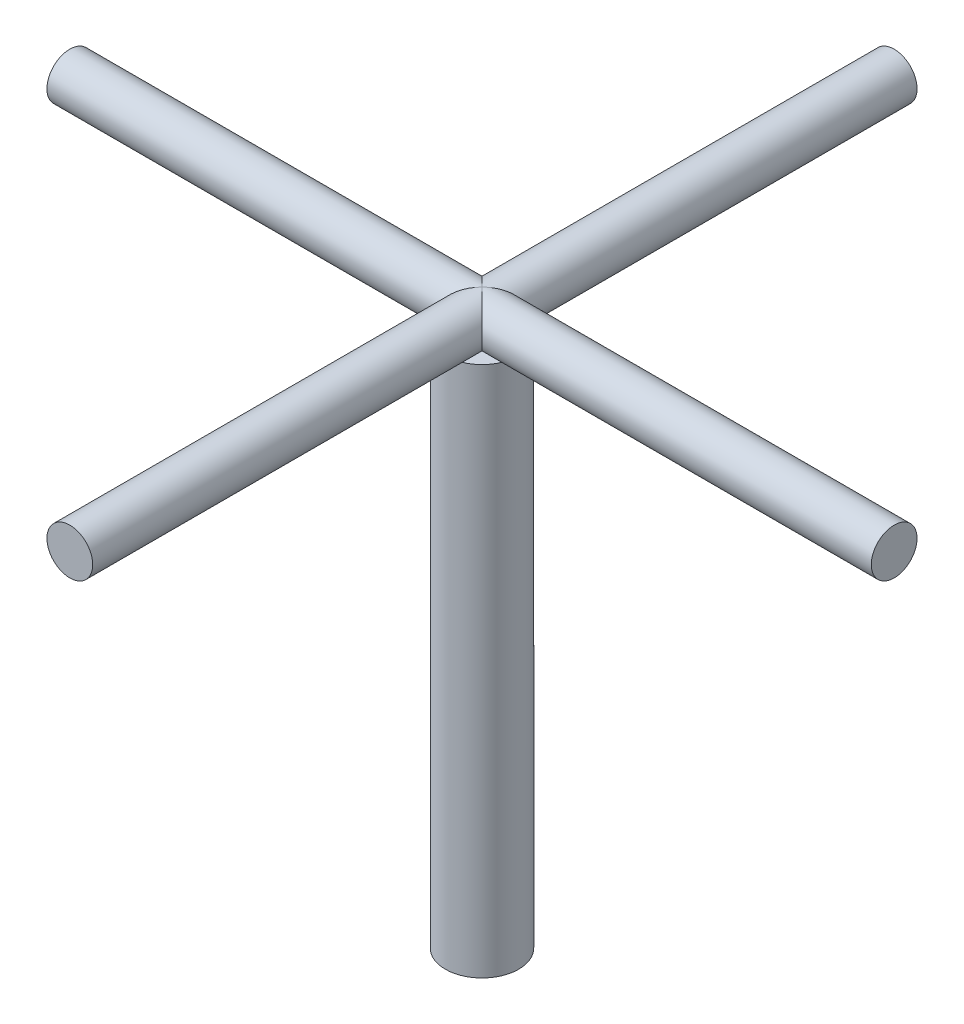
ISO-10303-21;
HEADER;
FILE_DESCRIPTION(('STEP AP214'),'2;1');
FILE_NAME('part.step','',(''),(''),'','','');
FILE_SCHEMA(('AUTOMOTIVE_DESIGN { 1 0 10303 214 1 1 1 1 }'));
ENDSEC;
DATA;
#1=APPLICATION_CONTEXT('core data for automotive mechanical design processes');
#2=APPLICATION_PROTOCOL_DEFINITION('international standard','automotive_design',2000,#1);
#3=PRODUCT_CONTEXT('',#1,'mechanical');
#4=PRODUCT('Part','Part','',(#3));
#5=PRODUCT_RELATED_PRODUCT_CATEGORY('part','',(#4));
#6=PRODUCT_DEFINITION_FORMATION('','',#4);
#7=PRODUCT_DEFINITION_CONTEXT('part definition',#1,'design');
#8=PRODUCT_DEFINITION('design','',#6,#7);
#9=PRODUCT_DEFINITION_SHAPE('','',#8);
#10=(LENGTH_UNIT() NAMED_UNIT(*) SI_UNIT(.MILLI.,.METRE.));
#11=(NAMED_UNIT(*) PLANE_ANGLE_UNIT() SI_UNIT($,.RADIAN.));
#12=(NAMED_UNIT(*) SI_UNIT($,.STERADIAN.) SOLID_ANGLE_UNIT());
#13=UNCERTAINTY_MEASURE_WITH_UNIT(LENGTH_MEASURE(1.E-05),#10,'distance_accuracy_value','');
#14=(GEOMETRIC_REPRESENTATION_CONTEXT(3) GLOBAL_UNCERTAINTY_ASSIGNED_CONTEXT((#13)) GLOBAL_UNIT_ASSIGNED_CONTEXT((#10,
#11,#12)) REPRESENTATION_CONTEXT('',''));
#15=CARTESIAN_POINT('',(0.,0.,0.));
#16=DIRECTION('',(0.,0.,1.));
#17=DIRECTION('',(1.,0.,0.));
#18=AXIS2_PLACEMENT_3D('',#15,#16,#17);
#19=CARTESIAN_POINT('',(0.,580.,0.));
#20=DIRECTION('',(0.,1.,0.));
#21=DIRECTION('',(0.,0.,1.));
#22=AXIS2_PLACEMENT_3D('',#19,#20,#21);
#23=PLANE('',#22);
#24=DIRECTION('',(1.,0.,0.));
#25=VECTOR('',#24,1.);
#26=CARTESIAN_POINT('',(-1.57116660247941E-13,580.,15.));
#27=LINE('',#26,#25);
#28=CARTESIAN_POINT('',(15.,580.,15.0000000000001));
#29=VERTEX_POINT('',#28);
#30=CARTESIAN_POINT('',(37.0809924354782,580.,15.0000000000004));
#31=VERTEX_POINT('',#30);
#32=EDGE_CURVE('E149',#29,#31,#27,.T.);
#33=ORIENTED_EDGE('',*,*,#32,.F.);
#34=DIRECTION('',(0.,0.,1.));
#35=VECTOR('',#34,1.);
#36=CARTESIAN_POINT('',(15.,580.,0.));
#37=LINE('',#36,#35);
#38=CARTESIAN_POINT('',(15.,580.,37.0809924354783));
#39=VERTEX_POINT('',#38);
#40=EDGE_CURVE('E134',#39,#29,#37,.F.);
#41=ORIENTED_EDGE('',*,*,#40,.F.);
#42=CARTESIAN_POINT('',(0.,580.,0.));
#43=DIRECTION('',(0.,1.,0.));
#44=DIRECTION('',(0.,0.,1.));
#45=AXIS2_PLACEMENT_3D('',#42,#43,#44);
#46=CIRCLE('',#45,40.);
#47=EDGE_CURVE('E150',#39,#31,#46,.T.);
#48=ORIENTED_EDGE('',*,*,#47,.T.);
#49=EDGE_LOOP('',(#33,#41,#48));
#50=FACE_BOUND('',#49,.T.);
#51=ADVANCED_FACE('F75',(#50),#23,.T.);
#52=CARTESIAN_POINT('',(0.,600.,0.));
#53=DIRECTION('',(0.,0.,1.));
#54=DIRECTION('',(0.,-1.,0.));
#55=AXIS2_PLACEMENT_3D('',#52,#53,#54);
#56=CYLINDRICAL_SURFACE('',#55,25.);
#57=CARTESIAN_POINT('',(0.,600.,0.));
#58=DIRECTION('',(0.707106781186544,0.,0.707106781186551));
#59=DIRECTION('',(-0.707106781186551,0.,0.707106781186544));
#60=AXIS2_PLACEMENT_3D('',#57,#58,#59);
#61=ELLIPSE('',#60,35.3553390593272,25.);
#62=CARTESIAN_POINT('',(15.,580.,-14.9999999999998));
#63=VERTEX_POINT('',#62);
#64=CARTESIAN_POINT('',(0.,625.,0.));
#65=VERTEX_POINT('',#64);
#66=EDGE_CURVE('E12',#63,#65,#61,.T.);
#67=ORIENTED_EDGE('',*,*,#66,.F.);
#68=CARTESIAN_POINT('',(15.,580.,-37.0809924354783));
#69=VERTEX_POINT('',#68);
#70=EDGE_CURVE('E146',#63,#69,#37,.F.);
#71=ORIENTED_EDGE('',*,*,#70,.T.);
#72=CARTESIAN_POINT('',(-15.,580.,-37.0809924354783));
#73=CARTESIAN_POINT('',(-14.7459745218142,579.809484592768,-37.1837514363406));
#74=CARTESIAN_POINT('',(-14.4879751676993,579.623544121096,-37.2850785403948));
#75=CARTESIAN_POINT('',(-13.964172832812,579.261066130471,-37.4844023602995));
#76=CARTESIAN_POINT('',(-13.6983692820855,579.084529300946,-37.5823988317749));
#77=CARTESIAN_POINT('',(-12.8892766057516,578.569286489404,-37.8707586080308));
#78=CARTESIAN_POINT('',(-12.3345400328034,578.245124386606,-38.055396627347));
#79=CARTESIAN_POINT('',(-11.1943709358806,577.636961361333,-38.4062954586563));
#80=CARTESIAN_POINT('',(-10.608808251497,577.353153215929,-38.5724672811305));
#81=CARTESIAN_POINT('',(-9.41223916826363,576.830281436133,-38.8817621726453));
#82=CARTESIAN_POINT('',(-8.80123805994426,576.591208554235,-39.0248900043968));
#83=CARTESIAN_POINT('',(-7.55437899974637,576.159518442846,-39.2853506958558));
#84=CARTESIAN_POINT('',(-6.91841989704923,575.967119306066,-39.4025622390265));
#85=CARTESIAN_POINT('',(-5.62862172804053,575.632759346444,-39.6073848970811));
#86=CARTESIAN_POINT('',(-4.97478159391387,575.49080154296,-39.6949942399972));
#87=CARTESIAN_POINT('',(-3.65612469100375,575.259757242769,-39.8380646720393));
#88=CARTESIAN_POINT('',(-2.99134135735942,575.170532517207,-39.8936098018845));
#89=CARTESIAN_POINT('',(-1.65484543726967,575.045806023509,-39.971357162976));
#90=CARTESIAN_POINT('',(-0.983133570623566,575.010298730199,-39.9935628233928));
#91=CARTESIAN_POINT('',(0.303915825987577,574.994282294661,-40.003574050599));
#92=CARTESIAN_POINT('',(0.919182537126278,575.009346804786,-39.9941482215066));
#93=CARTESIAN_POINT('',(2.14583215193503,575.084684764968,-39.9471157474964));
#94=CARTESIAN_POINT('',(2.75721525027303,575.144955930694,-39.9095105265064));
#95=CARTESIAN_POINT('',(3.97218313736314,575.309961591268,-39.8069570183444));
#96=CARTESIAN_POINT('',(4.57576016702786,575.414737275043,-39.7419834021901));
#97=CARTESIAN_POINT('',(5.77038691656092,575.667400542264,-39.5861783093076));
#98=CARTESIAN_POINT('',(6.36143671963058,575.815287839281,-39.4953470043747));
#99=CARTESIAN_POINT('',(7.51872000529632,576.149919272116,-39.2913353950447));
#100=CARTESIAN_POINT('',(8.08519097109615,576.336057902977,-39.1785046109782));
#101=CARTESIAN_POINT('',(9.19944298507947,576.746552687481,-38.9319391786158));
#102=CARTESIAN_POINT('',(9.7472224882139,576.970911991329,-38.7982028073247));
#103=CARTESIAN_POINT('',(10.8210595967458,577.455567490769,-38.5125064915463));
#104=CARTESIAN_POINT('',(11.3471355943065,577.715832411075,-38.360562421694));
#105=CARTESIAN_POINT('',(12.3759122353569,578.270340196483,-38.0411195082632));
#106=CARTESIAN_POINT('',(12.8786206700828,578.564571620792,-37.8736259058686));
#107=CARTESIAN_POINT('',(13.6492393615751,579.052245212441,-37.6003570018833));
#108=CARTESIAN_POINT('',(13.9255559871543,579.23492738064,-37.4988480436821));
#109=CARTESIAN_POINT('',(14.4693301108826,579.610116125738,-37.2923977255915));
#110=CARTESIAN_POINT('',(14.7368024064563,579.802604764437,-37.1874627506237));
#111=CARTESIAN_POINT('',(15.,580.,-37.0809924354783));
#112=B_SPLINE_CURVE_WITH_KNOTS('',3,(#72,#73,#74,#75,#76,#77,#78,#79,#80,#81,#82,#83,#84,#85,
#86,#87,#88,#89,#90,#91,#92,#93,#94,#95,#96,#97,#98,#99,#100,#101,#102,#103,#104,#105,#106,#107,
#108,#109,#110,#111),.UNSPECIFIED.,.F.,.F.,(4,2,2,2,2,2,2,2,2,2,2,2,2,2,2,2,2,2,2,4),(0.,
1.00111109616409,2.00229548797715,4.00558756341024,6.01814939403041,8.03029473477344,
10.051668562114,12.0731633661002,14.0893354635504,16.1053001710193,17.9495765930167,
19.7937598285064,21.6396535871227,23.485535082135,25.3041816312726,27.1229781485838,
28.9402003051583,30.7568121506425,31.7959224006352,32.8331957404198),.UNSPECIFIED.);
#113=CARTESIAN_POINT('',(-15.,580.,-37.0809924354783));
#114=VERTEX_POINT('',#113);
#115=EDGE_CURVE('E228',#114,#69,#112,.T.);
#116=ORIENTED_EDGE('',*,*,#115,.F.);
#117=DIRECTION('',(0.,0.,-1.));
#118=VECTOR('',#117,1.);
#119=CARTESIAN_POINT('',(-15.,580.,0.));
#120=LINE('',#119,#118);
#121=CARTESIAN_POINT('',(-15.,580.,-15.));
#122=VERTEX_POINT('',#121);
#123=EDGE_CURVE('E221',#114,#122,#120,.F.);
#124=ORIENTED_EDGE('',*,*,#123,.T.);
#125=CARTESIAN_POINT('',(0.,600.,0.));
#126=DIRECTION('',(-0.707106781186549,0.,0.707106781186546));
#127=DIRECTION('',(-0.707106781186546,0.,-0.707106781186549));
#128=AXIS2_PLACEMENT_3D('',#125,#126,#127);
#129=ELLIPSE('',#128,35.3553390593274,25.);
#130=EDGE_CURVE('E156',#122,#65,#129,.F.);
#131=ORIENTED_EDGE('',*,*,#130,.T.);
#132=EDGE_LOOP('',(#67,#71,#116,#124,#131));
#133=FACE_BOUND('',#132,.T.);
#134=CARTESIAN_POINT('',(0.,600.,-450.));
#135=DIRECTION('',(0.,0.,-1.));
#136=DIRECTION('',(-1.,0.,0.));
#137=AXIS2_PLACEMENT_3D('',#134,#135,#136);
#138=CIRCLE('',#137,25.);
#139=CARTESIAN_POINT('',(-25.,600.,-450.));
#140=VERTEX_POINT('',#139);
#141=EDGE_CURVE('E229',#140,#140,#138,.T.);
#142=ORIENTED_EDGE('',*,*,#141,.F.);
#143=EDGE_LOOP('',(#142));
#144=FACE_BOUND('',#143,.T.);
#145=ADVANCED_FACE('F189',(#133,#144),#56,.T.);
#146=DIRECTION('',(1.,0.,0.));
#147=VECTOR('',#146,1.);
#148=CARTESIAN_POINT('',(1.57116660247941E-13,580.,-15.));
#149=LINE('',#148,#147);
#150=CARTESIAN_POINT('',(37.0809924354785,580.,-14.9999999999996));
#151=VERTEX_POINT('',#150);
#152=EDGE_CURVE('E92',#151,#63,#149,.F.);
#153=ORIENTED_EDGE('',*,*,#152,.F.);
#154=EDGE_CURVE('E173',#151,#69,#46,.T.);
#155=ORIENTED_EDGE('',*,*,#154,.T.);
#156=ORIENTED_EDGE('',*,*,#70,.F.);
#157=EDGE_LOOP('',(#153,#155,#156));
#158=FACE_BOUND('',#157,.T.);
#159=ADVANCED_FACE('F206',(#158),#23,.T.);
#160=ORIENTED_EDGE('',*,*,#123,.F.);
#161=CARTESIAN_POINT('',(-37.0809924354783,580.,-15.0000000000001));
#162=VERTEX_POINT('',#161);
#163=EDGE_CURVE('E223',#114,#162,#46,.T.);
#164=ORIENTED_EDGE('',*,*,#163,.T.);
#165=DIRECTION('',(-1.,0.,0.));
#166=VECTOR('',#165,1.);
#167=CARTESIAN_POINT('',(0.,580.,-15.));
#168=LINE('',#167,#166);
#169=EDGE_CURVE('E225',#122,#162,#168,.T.);
#170=ORIENTED_EDGE('',*,*,#169,.F.);
#171=EDGE_LOOP('',(#160,#164,#170));
#172=FACE_BOUND('',#171,.T.);
#173=ADVANCED_FACE('F199',(#172),#23,.T.);
#174=CARTESIAN_POINT('',(0.,580.,0.));
#175=DIRECTION('',(0.,-1.,0.));
#176=DIRECTION('',(0.,0.,-1.));
#177=AXIS2_PLACEMENT_3D('',#174,#175,#176);
#178=CYLINDRICAL_SURFACE('',#177,40.);
#179=ORIENTED_EDGE('',*,*,#154,.F.);
#180=CARTESIAN_POINT('',(37.0809924354785,580.,-14.9999999999996));
#181=CARTESIAN_POINT('',(37.1837514363408,579.809484592768,-14.7459745218138));
#182=CARTESIAN_POINT('',(37.2850785403949,579.623544121096,-14.4879751676989));
#183=CARTESIAN_POINT('',(37.4844023602997,579.261066130471,-13.9641728328116));
#184=CARTESIAN_POINT('',(37.582398831775,579.084529300946,-13.6983692820851));
#185=CARTESIAN_POINT('',(37.870758608031,578.569286489404,-12.8892766057512));
#186=CARTESIAN_POINT('',(38.0553966273472,578.245124386606,-12.334540032803));
#187=CARTESIAN_POINT('',(38.4062954586564,577.636961361333,-11.1943709358802));
#188=CARTESIAN_POINT('',(38.5724672811306,577.353153215929,-10.6088082514966));
#189=CARTESIAN_POINT('',(38.8817621726454,576.830281436133,-9.41223916826322));
#190=CARTESIAN_POINT('',(39.0248900043969,576.591208554235,-8.80123805994385));
#191=CARTESIAN_POINT('',(39.2853506958559,576.159518442846,-7.55437899974596));
#192=CARTESIAN_POINT('',(39.4025622390266,575.967119306066,-6.91841989704882));
#193=CARTESIAN_POINT('',(39.6073848970811,575.632759346444,-5.62862172804012));
#194=CARTESIAN_POINT('',(39.6949942399973,575.49080154296,-4.97478159391346));
#195=CARTESIAN_POINT('',(39.8380646720393,575.259757242769,-3.65612469100334));
#196=CARTESIAN_POINT('',(39.8936098018846,575.170532517207,-2.99134135735901));
#197=CARTESIAN_POINT('',(39.971357162976,575.045806023509,-1.65484543726925));
#198=CARTESIAN_POINT('',(39.9935628233928,575.010298730199,-0.98313357062315));
#199=CARTESIAN_POINT('',(40.003574050599,574.994282294661,0.303915825987993));
#200=CARTESIAN_POINT('',(39.9941482215065,575.009346804786,0.919182537126694));
#201=CARTESIAN_POINT('',(39.9471157474964,575.084684764968,2.14583215193545));
#202=CARTESIAN_POINT('',(39.9095105265064,575.144955930694,2.75721525027344));
#203=CARTESIAN_POINT('',(39.8069570183443,575.309961591268,3.97218313736355));
#204=CARTESIAN_POINT('',(39.74198340219,575.414737275043,4.57576016702827));
#205=CARTESIAN_POINT('',(39.5861783093075,575.667400542264,5.77038691656134));
#206=CARTESIAN_POINT('',(39.4953470043746,575.815287839281,6.361436719631));
#207=CARTESIAN_POINT('',(39.2913353950446,576.149919272116,7.51872000529673));
#208=CARTESIAN_POINT('',(39.1785046109781,576.336057902977,8.08519097109656));
#209=CARTESIAN_POINT('',(38.9319391786157,576.746552687481,9.19944298507987));
#210=CARTESIAN_POINT('',(38.7982028073246,576.970911991329,9.74722248821431));
#211=CARTESIAN_POINT('',(38.5125064915462,577.455567490769,10.8210595967462));
#212=CARTESIAN_POINT('',(38.3605624216939,577.715832411075,11.3471355943069));
#213=CARTESIAN_POINT('',(38.0411195082631,578.270340196483,12.3759122353573));
#214=CARTESIAN_POINT('',(37.8736259058684,578.564571620792,12.8786206700832));
#215=CARTESIAN_POINT('',(37.6003570018832,579.052245212441,13.6492393615755));
#216=CARTESIAN_POINT('',(37.498848043682,579.23492738064,13.9255559871547));
#217=CARTESIAN_POINT('',(37.2923977255913,579.610116125738,14.469330110883));
#218=CARTESIAN_POINT('',(37.1874627506235,579.802604764437,14.7368024064566));
#219=CARTESIAN_POINT('',(37.0809924354781,580.,15.0000000000004));
#220=B_SPLINE_CURVE_WITH_KNOTS('',3,(#180,#181,#182,#183,#184,#185,#186,#187,#188,#189,#190,
#191,#192,#193,#194,#195,#196,#197,#198,#199,#200,#201,#202,#203,#204,#205,#206,#207,#208,#209,
#210,#211,#212,#213,#214,#215,#216,#217,#218,#219),.UNSPECIFIED.,.F.,.F.,(4,2,2,2,2,2,2,2,2,2,2,
2,2,2,2,2,2,2,2,4),(0.,1.00111109616409,2.00229548797715,4.00558756341024,6.01814939403041,
8.03029473477344,10.051668562114,12.0731633661002,14.0893354635504,16.1053001710193,
17.9495765930167,19.7937598285064,21.6396535871227,23.485535082135,25.3041816312726,
27.1229781485838,28.9402003051583,30.7568121506425,31.7959224006352,32.8331957404198),.UNSPECIFIED.);
#221=EDGE_CURVE('E99',#151,#31,#220,.T.);
#222=ORIENTED_EDGE('',*,*,#221,.T.);
#223=ORIENTED_EDGE('',*,*,#47,.F.);
#224=CARTESIAN_POINT('',(15.,580.,37.0809924354783));
#225=CARTESIAN_POINT('',(14.7459745218142,579.809484592768,37.1837514363406));
#226=CARTESIAN_POINT('',(14.4879751676993,579.623544121096,37.2850785403948));
#227=CARTESIAN_POINT('',(13.964172832812,579.261066130471,37.4844023602995));
#228=CARTESIAN_POINT('',(13.6983692820855,579.084529300946,37.5823988317749));
#229=CARTESIAN_POINT('',(12.8892766057516,578.569286489404,37.8707586080308));
#230=CARTESIAN_POINT('',(12.3345400328034,578.245124386606,38.055396627347));
#231=CARTESIAN_POINT('',(11.1943709358806,577.636961361333,38.4062954586563));
#232=CARTESIAN_POINT('',(10.608808251497,577.353153215929,38.5724672811305));
#233=CARTESIAN_POINT('',(9.41223916826363,576.830281436133,38.8817621726453));
#234=CARTESIAN_POINT('',(8.80123805994426,576.591208554235,39.0248900043968));
#235=CARTESIAN_POINT('',(7.55437899974637,576.159518442846,39.2853506958558));
#236=CARTESIAN_POINT('',(6.91841989704923,575.967119306066,39.4025622390265));
#237=CARTESIAN_POINT('',(5.62862172804053,575.632759346444,39.6073848970811));
#238=CARTESIAN_POINT('',(4.97478159391387,575.49080154296,39.6949942399972));
#239=CARTESIAN_POINT('',(3.65612469100375,575.259757242769,39.8380646720393));
#240=CARTESIAN_POINT('',(2.99134135735942,575.170532517207,39.8936098018845));
#241=CARTESIAN_POINT('',(1.65484543726967,575.045806023509,39.971357162976));
#242=CARTESIAN_POINT('',(0.983133570623566,575.010298730199,39.9935628233928));
#243=CARTESIAN_POINT('',(-0.303915825987577,574.994282294661,40.003574050599));
#244=CARTESIAN_POINT('',(-0.919182537126278,575.009346804786,39.9941482215066));
#245=CARTESIAN_POINT('',(-2.14583215193503,575.084684764968,39.9471157474964));
#246=CARTESIAN_POINT('',(-2.75721525027303,575.144955930694,39.9095105265064));
#247=CARTESIAN_POINT('',(-3.97218313736314,575.309961591268,39.8069570183444));
#248=CARTESIAN_POINT('',(-4.57576016702786,575.414737275043,39.7419834021901));
#249=CARTESIAN_POINT('',(-5.77038691656092,575.667400542264,39.5861783093076));
#250=CARTESIAN_POINT('',(-6.36143671963058,575.815287839281,39.4953470043747));
#251=CARTESIAN_POINT('',(-7.51872000529632,576.149919272116,39.2913353950447));
#252=CARTESIAN_POINT('',(-8.08519097109615,576.336057902977,39.1785046109782));
#253=CARTESIAN_POINT('',(-9.19944298507947,576.746552687481,38.9319391786158));
#254=CARTESIAN_POINT('',(-9.7472224882139,576.970911991329,38.7982028073247));
#255=CARTESIAN_POINT('',(-10.8210595967458,577.455567490769,38.5125064915463));
#256=CARTESIAN_POINT('',(-11.3471355943065,577.715832411075,38.360562421694));
#257=CARTESIAN_POINT('',(-12.3759122353569,578.270340196483,38.0411195082632));
#258=CARTESIAN_POINT('',(-12.8786206700828,578.564571620792,37.8736259058686));
#259=CARTESIAN_POINT('',(-13.6492393615751,579.052245212441,37.6003570018833));
#260=CARTESIAN_POINT('',(-13.9255559871543,579.23492738064,37.4988480436821));
#261=CARTESIAN_POINT('',(-14.4693301108826,579.610116125738,37.2923977255915));
#262=CARTESIAN_POINT('',(-14.7368024064563,579.802604764437,37.1874627506237));
#263=CARTESIAN_POINT('',(-15.,580.,37.0809924354783));
#264=B_SPLINE_CURVE_WITH_KNOTS('',3,(#224,#225,#226,#227,#228,#229,#230,#231,#232,#233,#234,
#235,#236,#237,#238,#239,#240,#241,#242,#243,#244,#245,#246,#247,#248,#249,#250,#251,#252,#253,
#254,#255,#256,#257,#258,#259,#260,#261,#262,#263),.UNSPECIFIED.,.F.,.F.,(4,2,2,2,2,2,2,2,2,2,2,
2,2,2,2,2,2,2,2,4),(0.,1.00111109616409,2.00229548797715,4.00558756341024,6.01814939403041,
8.03029473477344,10.051668562114,12.0731633661002,14.0893354635504,16.1053001710193,
17.9495765930167,19.7937598285064,21.6396535871227,23.485535082135,25.3041816312726,
27.1229781485838,28.9402003051583,30.7568121506425,31.7959224006352,32.8331957404198),.UNSPECIFIED.);
#265=CARTESIAN_POINT('',(-15.,580.,37.0809924354783));
#266=VERTEX_POINT('',#265);
#267=EDGE_CURVE('E142',#39,#266,#264,.T.);
#268=ORIENTED_EDGE('',*,*,#267,.T.);
#269=CARTESIAN_POINT('',(-37.0809924354784,580.,14.9999999999999));
#270=VERTEX_POINT('',#269);
#271=EDGE_CURVE('E170',#270,#266,#46,.T.);
#272=ORIENTED_EDGE('',*,*,#271,.F.);
#273=CARTESIAN_POINT('',(-37.0809924354784,580.,14.9999999999999));
#274=CARTESIAN_POINT('',(-37.1837514363407,579.809484592768,14.7459745218141));
#275=CARTESIAN_POINT('',(-37.2850785403948,579.623544121096,14.4879751676992));
#276=CARTESIAN_POINT('',(-37.4844023602996,579.261066130471,13.9641728328119));
#277=CARTESIAN_POINT('',(-37.5823988317749,579.084529300946,13.6983692820853));
#278=CARTESIAN_POINT('',(-37.8707586080309,578.569286489404,12.8892766057515));
#279=CARTESIAN_POINT('',(-38.0553966273471,578.245124386606,12.3345400328033));
#280=CARTESIAN_POINT('',(-38.4062954586563,577.636961361333,11.1943709358804));
#281=CARTESIAN_POINT('',(-38.5724672811305,577.353153215929,10.6088082514968));
#282=CARTESIAN_POINT('',(-38.8817621726454,576.830281436133,9.41223916826349));
#283=CARTESIAN_POINT('',(-39.0248900043968,576.591208554235,8.80123805994412));
#284=CARTESIAN_POINT('',(-39.2853506958558,576.159518442846,7.55437899974623));
#285=CARTESIAN_POINT('',(-39.4025622390265,575.967119306066,6.91841989704909));
#286=CARTESIAN_POINT('',(-39.6073848970811,575.632759346444,5.62862172804039));
#287=CARTESIAN_POINT('',(-39.6949942399972,575.49080154296,4.97478159391373));
#288=CARTESIAN_POINT('',(-39.8380646720393,575.259757242769,3.65612469100361));
#289=CARTESIAN_POINT('',(-39.8936098018845,575.170532517207,2.99134135735928));
#290=CARTESIAN_POINT('',(-39.971357162976,575.045806023509,1.65484543726953));
#291=CARTESIAN_POINT('',(-39.9935628233928,575.010298730199,0.983133570623426));
#292=CARTESIAN_POINT('',(-40.003574050599,574.994282294661,-0.303915825987715));
#293=CARTESIAN_POINT('',(-39.9941482215066,575.009346804786,-0.919182537126416));
#294=CARTESIAN_POINT('',(-39.9471157474964,575.084684764968,-2.14583215193517));
#295=CARTESIAN_POINT('',(-39.9095105265064,575.144955930694,-2.75721525027316));
#296=CARTESIAN_POINT('',(-39.8069570183443,575.309961591268,-3.97218313736327));
#297=CARTESIAN_POINT('',(-39.7419834021901,575.414737275043,-4.57576016702799));
#298=CARTESIAN_POINT('',(-39.5861783093076,575.667400542264,-5.77038691656106));
#299=CARTESIAN_POINT('',(-39.4953470043747,575.815287839281,-6.36143671963072));
#300=CARTESIAN_POINT('',(-39.2913353950446,576.149919272116,-7.51872000529645));
#301=CARTESIAN_POINT('',(-39.1785046109782,576.336057902977,-8.08519097109629));
#302=CARTESIAN_POINT('',(-38.9319391786157,576.746552687481,-9.1994429850796));
#303=CARTESIAN_POINT('',(-38.7982028073247,576.970911991329,-9.74722248821404));
#304=CARTESIAN_POINT('',(-38.5125064915463,577.455567490769,-10.821059596746));
#305=CARTESIAN_POINT('',(-38.3605624216939,577.715832411075,-11.3471355943066));
#306=CARTESIAN_POINT('',(-38.0411195082632,578.270340196483,-12.375912235357));
#307=CARTESIAN_POINT('',(-37.8736259058685,578.564571620792,-12.8786206700829));
#308=CARTESIAN_POINT('',(-37.6003570018833,579.052245212441,-13.6492393615753));
#309=CARTESIAN_POINT('',(-37.4988480436821,579.23492738064,-13.9255559871545));
#310=CARTESIAN_POINT('',(-37.2923977255914,579.610116125738,-14.4693301108827));
#311=CARTESIAN_POINT('',(-37.1874627506236,579.802604764437,-14.7368024064564));
#312=CARTESIAN_POINT('',(-37.0809924354783,580.,-15.0000000000001));
#313=B_SPLINE_CURVE_WITH_KNOTS('',3,(#273,#274,#275,#276,#277,#278,#279,#280,#281,#282,#283,
#284,#285,#286,#287,#288,#289,#290,#291,#292,#293,#294,#295,#296,#297,#298,#299,#300,#301,#302,
#303,#304,#305,#306,#307,#308,#309,#310,#311,#312),.UNSPECIFIED.,.F.,.F.,(4,2,2,2,2,2,2,2,2,2,2,
2,2,2,2,2,2,2,2,4),(0.,1.00111109616409,2.00229548797716,4.00558756341025,6.01814939403041,
8.03029473477344,10.051668562114,12.0731633661002,14.0893354635504,16.1053001710193,
17.9495765930167,19.7937598285064,21.6396535871227,23.485535082135,25.3041816312726,
27.1229781485838,28.9402003051583,30.7568121506425,31.7959224006352,32.8331957404198),.UNSPECIFIED.);
#314=EDGE_CURVE('E236',#270,#162,#313,.T.);
#315=ORIENTED_EDGE('',*,*,#314,.T.);
#316=ORIENTED_EDGE('',*,*,#163,.F.);
#317=ORIENTED_EDGE('',*,*,#115,.T.);
#318=EDGE_LOOP('',(#179,#222,#223,#268,#272,#315,#316,#317));
#319=FACE_BOUND('',#318,.T.);
#320=CARTESIAN_POINT('',(0.,0.,0.));
#321=DIRECTION('',(0.,1.,0.));
#322=DIRECTION('',(0.,0.,1.));
#323=AXIS2_PLACEMENT_3D('',#320,#321,#322);
#324=CIRCLE('',#323,40.);
#325=CARTESIAN_POINT('',(0.,0.,40.));
#326=VERTEX_POINT('',#325);
#327=EDGE_CURVE('E166',#326,#326,#324,.T.);
#328=ORIENTED_EDGE('',*,*,#327,.T.);
#329=EDGE_LOOP('',(#328));
#330=FACE_BOUND('',#329,.T.);
#331=ADVANCED_FACE('F77',(#319,#330),#178,.T.);
#332=DIRECTION('',(-1.,0.,0.));
#333=VECTOR('',#332,1.);
#334=CARTESIAN_POINT('',(0.,580.,15.));
#335=LINE('',#334,#333);
#336=CARTESIAN_POINT('',(-15.,580.,14.9999999999999));
#337=VERTEX_POINT('',#336);
#338=EDGE_CURVE('E245',#270,#337,#335,.F.);
#339=ORIENTED_EDGE('',*,*,#338,.F.);
#340=ORIENTED_EDGE('',*,*,#271,.T.);
#341=DIRECTION('',(0.,0.,1.));
#342=VECTOR('',#341,1.);
#343=CARTESIAN_POINT('',(-15.,580.,0.));
#344=LINE('',#343,#342);
#345=EDGE_CURVE('E145',#337,#266,#344,.T.);
#346=ORIENTED_EDGE('',*,*,#345,.F.);
#347=EDGE_LOOP('',(#339,#340,#346));
#348=FACE_BOUND('',#347,.T.);
#349=ADVANCED_FACE('F196',(#348),#23,.T.);
#350=CARTESIAN_POINT('',(0.,0.,0.));
#351=DIRECTION('',(0.,1.,0.));
#352=DIRECTION('',(0.,0.,1.));
#353=AXIS2_PLACEMENT_3D('',#350,#351,#352);
#354=PLANE('',#353);
#355=ORIENTED_EDGE('',*,*,#327,.F.);
#356=EDGE_LOOP('',(#355));
#357=FACE_BOUND('',#356,.T.);
#358=ADVANCED_FACE('F190',(#357),#354,.F.);
#359=CARTESIAN_POINT('',(0.,600.,450.));
#360=DIRECTION('',(0.,0.,1.));
#361=DIRECTION('',(1.,0.,0.));
#362=AXIS2_PLACEMENT_3D('',#359,#360,#361);
#363=PLANE('',#362);
#364=CARTESIAN_POINT('',(0.,600.,450.));
#365=DIRECTION('',(0.,0.,1.));
#366=DIRECTION('',(1.,0.,0.));
#367=AXIS2_PLACEMENT_3D('',#364,#365,#366);
#368=CIRCLE('',#367,25.);
#369=CARTESIAN_POINT('',(25.,600.,450.));
#370=VERTEX_POINT('',#369);
#371=EDGE_CURVE('E181',#370,#370,#368,.T.);
#372=ORIENTED_EDGE('',*,*,#371,.T.);
#373=EDGE_LOOP('',(#372));
#374=FACE_BOUND('',#373,.T.);
#375=ADVANCED_FACE('F188',(#374),#363,.T.);
#376=CARTESIAN_POINT('',(0.,600.,0.));
#377=DIRECTION('',(-0.707106781186551,0.,0.707106781186544));
#378=DIRECTION('',(0.707106781186544,0.,0.707106781186551));
#379=AXIS2_PLACEMENT_3D('',#376,#377,#378);
#380=ELLIPSE('',#379,35.3553390593276,25.);
#381=EDGE_CURVE('E85',#65,#29,#380,.F.);
#382=ORIENTED_EDGE('',*,*,#381,.F.);
#383=CARTESIAN_POINT('',(0.,600.,0.));
#384=DIRECTION('',(0.707106781186546,0.,0.707106781186549));
#385=DIRECTION('',(-0.707106781186549,0.,0.707106781186546));
#386=AXIS2_PLACEMENT_3D('',#383,#384,#385);
#387=ELLIPSE('',#386,35.3553390593273,25.);
#388=EDGE_CURVE('E159',#337,#65,#387,.F.);
#389=ORIENTED_EDGE('',*,*,#388,.F.);
#390=ORIENTED_EDGE('',*,*,#345,.T.);
#391=ORIENTED_EDGE('',*,*,#267,.F.);
#392=ORIENTED_EDGE('',*,*,#40,.T.);
#393=EDGE_LOOP('',(#382,#389,#390,#391,#392));
#394=FACE_BOUND('',#393,.T.);
#395=ORIENTED_EDGE('',*,*,#371,.F.);
#396=EDGE_LOOP('',(#395));
#397=FACE_BOUND('',#396,.T.);
#398=ADVANCED_FACE('F136',(#394,#397),#56,.T.);
#399=CARTESIAN_POINT('',(-450.,600.,-1.57116660247941E-12));
#400=DIRECTION('',(-1.,0.,0.));
#401=DIRECTION('',(0.,0.,1.));
#402=AXIS2_PLACEMENT_3D('',#399,#400,#401);
#403=PLANE('',#402);
#404=CARTESIAN_POINT('',(-450.,600.,-1.57116660247941E-12));
#405=DIRECTION('',(-1.,0.,0.));
#406=DIRECTION('',(0.,0.,1.));
#407=AXIS2_PLACEMENT_3D('',#404,#405,#406);
#408=CIRCLE('',#407,25.);
#409=CARTESIAN_POINT('',(-450.,600.,24.9999999999984));
#410=VERTEX_POINT('',#409);
#411=EDGE_CURVE('E241',#410,#410,#408,.T.);
#412=ORIENTED_EDGE('',*,*,#411,.T.);
#413=EDGE_LOOP('',(#412));
#414=FACE_BOUND('',#413,.T.);
#415=ADVANCED_FACE('F187',(#414),#403,.T.);
#416=CARTESIAN_POINT('',(0.,600.,0.));
#417=DIRECTION('',(-1.,0.,0.));
#418=DIRECTION('',(0.,0.,1.));
#419=AXIS2_PLACEMENT_3D('',#416,#417,#418);
#420=CYLINDRICAL_SURFACE('',#419,25.);
#421=ORIENTED_EDGE('',*,*,#130,.F.);
#422=ORIENTED_EDGE('',*,*,#169,.T.);
#423=ORIENTED_EDGE('',*,*,#314,.F.);
#424=ORIENTED_EDGE('',*,*,#338,.T.);
#425=ORIENTED_EDGE('',*,*,#388,.T.);
#426=EDGE_LOOP('',(#421,#422,#423,#424,#425));
#427=FACE_BOUND('',#426,.T.);
#428=ORIENTED_EDGE('',*,*,#411,.F.);
#429=EDGE_LOOP('',(#428));
#430=FACE_BOUND('',#429,.T.);
#431=ADVANCED_FACE('F195',(#427,#430),#420,.T.);
#432=CARTESIAN_POINT('',(0.,600.,-450.));
#433=DIRECTION('',(0.,0.,-1.));
#434=DIRECTION('',(-1.,0.,0.));
#435=AXIS2_PLACEMENT_3D('',#432,#433,#434);
#436=PLANE('',#435);
#437=ORIENTED_EDGE('',*,*,#141,.T.);
#438=EDGE_LOOP('',(#437));
#439=FACE_BOUND('',#438,.T.);
#440=ADVANCED_FACE('F259',(#439),#436,.T.);
#441=CARTESIAN_POINT('',(0.,600.,0.));
#442=DIRECTION('',(1.,0.,0.));
#443=DIRECTION('',(0.,0.,-1.));
#444=AXIS2_PLACEMENT_3D('',#441,#442,#443);
#445=CYLINDRICAL_SURFACE('',#444,25.);
#446=CARTESIAN_POINT('',(450.,600.,4.71349980743823E-12));
#447=DIRECTION('',(1.,0.,0.));
#448=DIRECTION('',(0.,0.,-1.));
#449=AXIS2_PLACEMENT_3D('',#446,#447,#448);
#450=CIRCLE('',#449,25.);
#451=CARTESIAN_POINT('',(450.,600.,-24.9999999999953));
#452=VERTEX_POINT('',#451);
#453=EDGE_CURVE('E296',#452,#452,#450,.T.);
#454=ORIENTED_EDGE('',*,*,#453,.F.);
#455=EDGE_LOOP('',(#454));
#456=FACE_BOUND('',#455,.T.);
#457=ORIENTED_EDGE('',*,*,#221,.F.);
#458=ORIENTED_EDGE('',*,*,#152,.T.);
#459=ORIENTED_EDGE('',*,*,#66,.T.);
#460=ORIENTED_EDGE('',*,*,#381,.T.);
#461=ORIENTED_EDGE('',*,*,#32,.T.);
#462=EDGE_LOOP('',(#457,#458,#459,#460,#461));
#463=FACE_BOUND('',#462,.T.);
#464=ADVANCED_FACE('F154',(#456,#463),#445,.T.);
#465=CARTESIAN_POINT('',(450.,600.,4.71349980743823E-12));
#466=DIRECTION('',(1.,0.,0.));
#467=DIRECTION('',(0.,0.,-1.));
#468=AXIS2_PLACEMENT_3D('',#465,#466,#467);
#469=PLANE('',#468);
#470=ORIENTED_EDGE('',*,*,#453,.T.);
#471=EDGE_LOOP('',(#470));
#472=FACE_BOUND('',#471,.T.);
#473=ADVANCED_FACE('F257',(#472),#469,.T.);
#474=CLOSED_SHELL('',(#51,#145,#159,#173,#331,#349,#358,#375,#398,#415,#431,#440,#464,#473));
#475=MANIFOLD_SOLID_BREP('B2',#474);
#476=ADVANCED_BREP_SHAPE_REPRESENTATION('',(#18,#475),#14);
#477=SHAPE_DEFINITION_REPRESENTATION(#9,#476);
ENDSEC;
END-ISO-10303-21;
